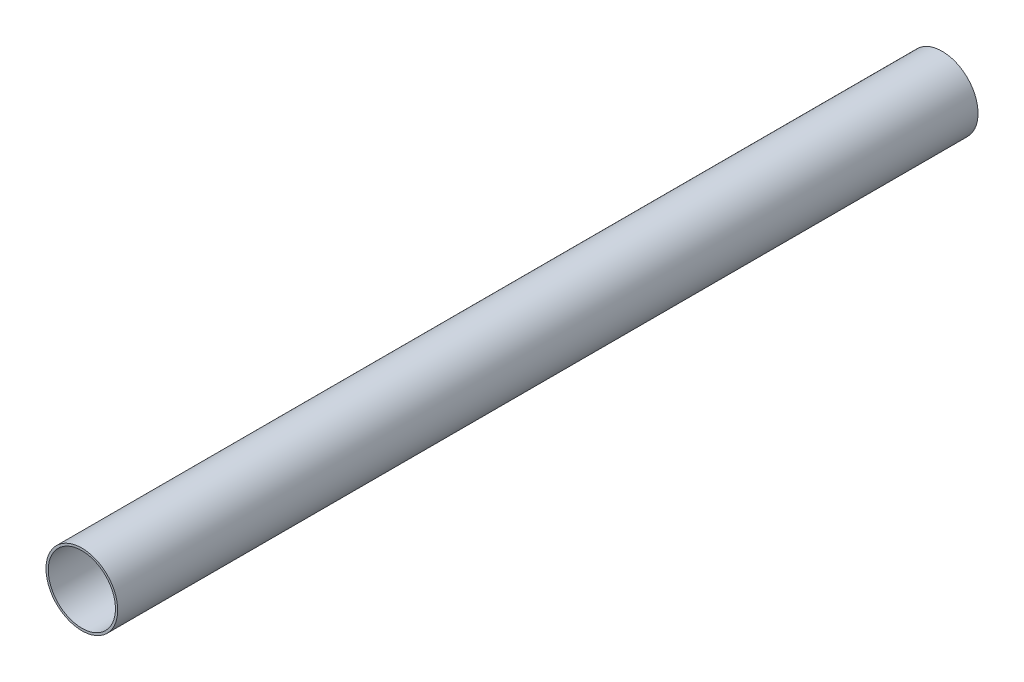
ISO-10303-21;
HEADER;
FILE_DESCRIPTION(('STEP AP214'),'2;1');
FILE_NAME('part.step','',(''),(''),'','','');
FILE_SCHEMA(('AUTOMOTIVE_DESIGN { 1 0 10303 214 1 1 1 1 }'));
ENDSEC;
DATA;
#1=APPLICATION_CONTEXT('core data for automotive mechanical design processes');
#2=APPLICATION_PROTOCOL_DEFINITION('international standard','automotive_design',2000,#1);
#3=PRODUCT_CONTEXT('',#1,'mechanical');
#4=PRODUCT('Part','Part','',(#3));
#5=PRODUCT_RELATED_PRODUCT_CATEGORY('part','',(#4));
#6=PRODUCT_DEFINITION_FORMATION('','',#4);
#7=PRODUCT_DEFINITION_CONTEXT('part definition',#1,'design');
#8=PRODUCT_DEFINITION('design','',#6,#7);
#9=PRODUCT_DEFINITION_SHAPE('','',#8);
#10=(LENGTH_UNIT() NAMED_UNIT(*) SI_UNIT(.MILLI.,.METRE.));
#11=(NAMED_UNIT(*) PLANE_ANGLE_UNIT() SI_UNIT($,.RADIAN.));
#12=(NAMED_UNIT(*) SI_UNIT($,.STERADIAN.) SOLID_ANGLE_UNIT());
#13=UNCERTAINTY_MEASURE_WITH_UNIT(LENGTH_MEASURE(1.E-05),#10,'distance_accuracy_value','');
#14=(GEOMETRIC_REPRESENTATION_CONTEXT(3) GLOBAL_UNCERTAINTY_ASSIGNED_CONTEXT((#13)) GLOBAL_UNIT_ASSIGNED_CONTEXT((#10,
#11,#12)) REPRESENTATION_CONTEXT('',''));
#15=CARTESIAN_POINT('',(0.,0.,0.));
#16=DIRECTION('',(0.,0.,1.));
#17=DIRECTION('',(1.,0.,0.));
#18=AXIS2_PLACEMENT_3D('',#15,#16,#17);
#19=CARTESIAN_POINT('',(0.,0.,1219.2));
#20=DIRECTION('',(0.,0.,1.));
#21=DIRECTION('',(1.,0.,0.));
#22=AXIS2_PLACEMENT_3D('',#19,#20,#21);
#23=PLANE('',#22);
#24=CARTESIAN_POINT('',(0.,0.,1219.2));
#25=DIRECTION('',(0.,0.,1.));
#26=DIRECTION('',(1.,0.,0.));
#27=AXIS2_PLACEMENT_3D('',#24,#25,#26);
#28=CIRCLE('',#27,50.8);
#29=CARTESIAN_POINT('',(-50.8,0.,1219.2));
#30=VERTEX_POINT('',#29);
#31=EDGE_CURVE('E10',#30,#30,#28,.T.);
#32=ORIENTED_EDGE('',*,*,#31,.T.);
#33=EDGE_LOOP('',(#32));
#34=FACE_BOUND('',#33,.T.);
#35=CARTESIAN_POINT('',(0.,0.,1219.2));
#36=DIRECTION('',(0.,0.,1.));
#37=DIRECTION('',(1.,0.,0.));
#38=AXIS2_PLACEMENT_3D('',#35,#36,#37);
#39=CIRCLE('',#38,47.625);
#40=CARTESIAN_POINT('',(-47.625,0.,1219.2));
#41=VERTEX_POINT('',#40);
#42=EDGE_CURVE('E50',#41,#41,#39,.T.);
#43=ORIENTED_EDGE('',*,*,#42,.F.);
#44=EDGE_LOOP('',(#43));
#45=FACE_BOUND('',#44,.T.);
#46=ADVANCED_FACE('F39',(#34,#45),#23,.T.);
#47=CARTESIAN_POINT('',(0.,0.,0.));
#48=DIRECTION('',(0.,0.,1.));
#49=DIRECTION('',(1.,0.,0.));
#50=AXIS2_PLACEMENT_3D('',#47,#48,#49);
#51=PLANE('',#50);
#52=CARTESIAN_POINT('',(0.,0.,0.));
#53=DIRECTION('',(0.,0.,1.));
#54=DIRECTION('',(1.,0.,0.));
#55=AXIS2_PLACEMENT_3D('',#52,#53,#54);
#56=CIRCLE('',#55,50.8);
#57=CARTESIAN_POINT('',(-50.8,0.,0.));
#58=VERTEX_POINT('',#57);
#59=EDGE_CURVE('E43',#58,#58,#56,.T.);
#60=ORIENTED_EDGE('',*,*,#59,.F.);
#61=EDGE_LOOP('',(#60));
#62=FACE_BOUND('',#61,.T.);
#63=CARTESIAN_POINT('',(0.,0.,0.));
#64=DIRECTION('',(0.,0.,1.));
#65=DIRECTION('',(1.,0.,0.));
#66=AXIS2_PLACEMENT_3D('',#63,#64,#65);
#67=CIRCLE('',#66,47.625);
#68=CARTESIAN_POINT('',(-47.625,0.,0.));
#69=VERTEX_POINT('',#68);
#70=EDGE_CURVE('E52',#69,#69,#67,.T.);
#71=ORIENTED_EDGE('',*,*,#70,.T.);
#72=EDGE_LOOP('',(#71));
#73=FACE_BOUND('',#72,.T.);
#74=ADVANCED_FACE('F62',(#62,#73),#51,.F.);
#75=CARTESIAN_POINT('',(0.,0.,1219.2));
#76=DIRECTION('',(0.,0.,-1.));
#77=DIRECTION('',(-1.,0.,0.));
#78=AXIS2_PLACEMENT_3D('',#75,#76,#77);
#79=CYLINDRICAL_SURFACE('',#78,50.8);
#80=CARTESIAN_POINT('',(-50.8,0.,1219.2));
#81=CARTESIAN_POINT('',(-50.8,0.,1206.5));
#82=CARTESIAN_POINT('',(-50.8,0.,1193.8));
#83=CARTESIAN_POINT('',(-50.8,0.,1168.4));
#84=CARTESIAN_POINT('',(-50.8,0.,1155.7));
#85=CARTESIAN_POINT('',(-50.8,0.,1130.3));
#86=CARTESIAN_POINT('',(-50.8,0.,1117.6));
#87=CARTESIAN_POINT('',(-50.8,0.,1092.2));
#88=CARTESIAN_POINT('',(-50.8,0.,1079.5));
#89=CARTESIAN_POINT('',(-50.8,0.,1054.1));
#90=CARTESIAN_POINT('',(-50.8,0.,1041.4));
#91=CARTESIAN_POINT('',(-50.8,0.,1016.));
#92=CARTESIAN_POINT('',(-50.8,0.,1003.3));
#93=CARTESIAN_POINT('',(-50.8,0.,977.9));
#94=CARTESIAN_POINT('',(-50.8,0.,965.2));
#95=CARTESIAN_POINT('',(-50.8,0.,939.8));
#96=CARTESIAN_POINT('',(-50.8,0.,927.1));
#97=CARTESIAN_POINT('',(-50.8,0.,901.7));
#98=CARTESIAN_POINT('',(-50.8,0.,889.));
#99=CARTESIAN_POINT('',(-50.8,0.,863.6));
#100=CARTESIAN_POINT('',(-50.8,0.,850.9));
#101=CARTESIAN_POINT('',(-50.8,0.,825.5));
#102=CARTESIAN_POINT('',(-50.8,0.,812.8));
#103=CARTESIAN_POINT('',(-50.8,0.,787.4));
#104=CARTESIAN_POINT('',(-50.8,0.,774.7));
#105=CARTESIAN_POINT('',(-50.8,0.,749.3));
#106=CARTESIAN_POINT('',(-50.8,0.,736.6));
#107=CARTESIAN_POINT('',(-50.8,0.,711.2));
#108=CARTESIAN_POINT('',(-50.8,0.,698.5));
#109=CARTESIAN_POINT('',(-50.8,0.,673.1));
#110=CARTESIAN_POINT('',(-50.8,0.,660.4));
#111=CARTESIAN_POINT('',(-50.8,0.,635.));
#112=CARTESIAN_POINT('',(-50.8,0.,622.3));
#113=CARTESIAN_POINT('',(-50.8,0.,596.9));
#114=CARTESIAN_POINT('',(-50.8,0.,584.2));
#115=CARTESIAN_POINT('',(-50.8,0.,558.8));
#116=CARTESIAN_POINT('',(-50.8,0.,546.1));
#117=CARTESIAN_POINT('',(-50.8,0.,520.7));
#118=CARTESIAN_POINT('',(-50.8,0.,508.));
#119=CARTESIAN_POINT('',(-50.8,0.,482.6));
#120=CARTESIAN_POINT('',(-50.8,0.,469.9));
#121=CARTESIAN_POINT('',(-50.8,0.,444.5));
#122=CARTESIAN_POINT('',(-50.8,0.,431.8));
#123=CARTESIAN_POINT('',(-50.8,0.,406.4));
#124=CARTESIAN_POINT('',(-50.8,0.,393.7));
#125=CARTESIAN_POINT('',(-50.8,0.,368.3));
#126=CARTESIAN_POINT('',(-50.8,0.,355.6));
#127=CARTESIAN_POINT('',(-50.8,0.,330.2));
#128=CARTESIAN_POINT('',(-50.8,0.,317.5));
#129=CARTESIAN_POINT('',(-50.8,0.,292.1));
#130=CARTESIAN_POINT('',(-50.8,0.,279.4));
#131=CARTESIAN_POINT('',(-50.8,0.,254.));
#132=CARTESIAN_POINT('',(-50.8,0.,241.3));
#133=CARTESIAN_POINT('',(-50.8,0.,215.9));
#134=CARTESIAN_POINT('',(-50.8,0.,203.2));
#135=CARTESIAN_POINT('',(-50.8,0.,177.8));
#136=CARTESIAN_POINT('',(-50.8,0.,165.1));
#137=CARTESIAN_POINT('',(-50.8,0.,139.7));
#138=CARTESIAN_POINT('',(-50.8,0.,127.));
#139=CARTESIAN_POINT('',(-50.8,0.,101.6));
#140=CARTESIAN_POINT('',(-50.8,0.,88.9));
#141=CARTESIAN_POINT('',(-50.8,0.,63.5));
#142=CARTESIAN_POINT('',(-50.8,0.,50.8));
#143=CARTESIAN_POINT('',(-50.8,0.,25.4));
#144=CARTESIAN_POINT('',(-50.8,0.,12.7));
#145=CARTESIAN_POINT('',(-50.8,0.,0.));
#146=B_SPLINE_CURVE_WITH_KNOTS('',3,(#80,#81,#82,#83,#84,#85,#86,#87,#88,#89,#90,#91,#92,#93,
#94,#95,#96,#97,#98,#99,#100,#101,#102,#103,#104,#105,#106,#107,#108,#109,#110,#111,#112,#113,
#114,#115,#116,#117,#118,#119,#120,#121,#122,#123,#124,#125,#126,#127,#128,#129,#130,#131,#132,
#133,#134,#135,#136,#137,#138,#139,#140,#141,#142,#143,#144,#145),.UNSPECIFIED.,.F.,.F.,(4,2,2,
2,2,2,2,2,2,2,2,2,2,2,2,2,2,2,2,2,2,2,2,2,2,2,2,2,2,2,2,2,4),(0.,38.1,76.2,114.3,152.4,190.5,
228.6,266.7,304.8,342.9,381.,419.1,457.2,495.3,533.4,571.5,609.6,647.7,685.8,723.9,762.,800.1,
838.2,876.3,914.4,952.5,990.6,1028.7,1066.8,1104.9,1143.,1181.1,1219.2),.UNSPECIFIED.);
#147=EDGE_CURVE('BSEAM41',#30,#58,#146,.T.);
#148=ORIENTED_EDGE('',*,*,#31,.F.);
#149=ORIENTED_EDGE('',*,*,#59,.T.);
#150=ORIENTED_EDGE('',*,*,#147,.T.);
#151=ORIENTED_EDGE('',*,*,#147,.F.);
#152=EDGE_LOOP('',(#148,#150,#149,#151));
#153=FACE_BOUND('',#152,.T.);
#154=ADVANCED_FACE('F41',(#153),#79,.T.);
#155=CARTESIAN_POINT('',(0.,0.,1219.2));
#156=DIRECTION('',(0.,0.,-1.));
#157=DIRECTION('',(-1.,0.,0.));
#158=AXIS2_PLACEMENT_3D('',#155,#156,#157);
#159=CYLINDRICAL_SURFACE('',#158,47.625);
#160=CARTESIAN_POINT('',(-47.625,0.,1219.2));
#161=CARTESIAN_POINT('',(-47.625,0.,1206.5));
#162=CARTESIAN_POINT('',(-47.625,0.,1193.8));
#163=CARTESIAN_POINT('',(-47.625,0.,1168.4));
#164=CARTESIAN_POINT('',(-47.625,0.,1155.7));
#165=CARTESIAN_POINT('',(-47.625,0.,1130.3));
#166=CARTESIAN_POINT('',(-47.625,0.,1117.6));
#167=CARTESIAN_POINT('',(-47.625,0.,1092.2));
#168=CARTESIAN_POINT('',(-47.625,0.,1079.5));
#169=CARTESIAN_POINT('',(-47.625,0.,1054.1));
#170=CARTESIAN_POINT('',(-47.625,0.,1041.4));
#171=CARTESIAN_POINT('',(-47.625,0.,1016.));
#172=CARTESIAN_POINT('',(-47.625,0.,1003.3));
#173=CARTESIAN_POINT('',(-47.625,0.,977.9));
#174=CARTESIAN_POINT('',(-47.625,0.,965.2));
#175=CARTESIAN_POINT('',(-47.625,0.,939.8));
#176=CARTESIAN_POINT('',(-47.625,0.,927.1));
#177=CARTESIAN_POINT('',(-47.625,0.,901.7));
#178=CARTESIAN_POINT('',(-47.625,0.,889.));
#179=CARTESIAN_POINT('',(-47.625,0.,863.6));
#180=CARTESIAN_POINT('',(-47.625,0.,850.9));
#181=CARTESIAN_POINT('',(-47.625,0.,825.5));
#182=CARTESIAN_POINT('',(-47.625,0.,812.8));
#183=CARTESIAN_POINT('',(-47.625,0.,787.4));
#184=CARTESIAN_POINT('',(-47.625,0.,774.7));
#185=CARTESIAN_POINT('',(-47.625,0.,749.3));
#186=CARTESIAN_POINT('',(-47.625,0.,736.6));
#187=CARTESIAN_POINT('',(-47.625,0.,711.2));
#188=CARTESIAN_POINT('',(-47.625,0.,698.5));
#189=CARTESIAN_POINT('',(-47.625,0.,673.1));
#190=CARTESIAN_POINT('',(-47.625,0.,660.4));
#191=CARTESIAN_POINT('',(-47.625,0.,635.));
#192=CARTESIAN_POINT('',(-47.625,0.,622.3));
#193=CARTESIAN_POINT('',(-47.625,0.,596.9));
#194=CARTESIAN_POINT('',(-47.625,0.,584.2));
#195=CARTESIAN_POINT('',(-47.625,0.,558.8));
#196=CARTESIAN_POINT('',(-47.625,0.,546.1));
#197=CARTESIAN_POINT('',(-47.625,0.,520.7));
#198=CARTESIAN_POINT('',(-47.625,0.,508.));
#199=CARTESIAN_POINT('',(-47.625,0.,482.6));
#200=CARTESIAN_POINT('',(-47.625,0.,469.9));
#201=CARTESIAN_POINT('',(-47.625,0.,444.5));
#202=CARTESIAN_POINT('',(-47.625,0.,431.8));
#203=CARTESIAN_POINT('',(-47.625,0.,406.4));
#204=CARTESIAN_POINT('',(-47.625,0.,393.7));
#205=CARTESIAN_POINT('',(-47.625,0.,368.3));
#206=CARTESIAN_POINT('',(-47.625,0.,355.6));
#207=CARTESIAN_POINT('',(-47.625,0.,330.2));
#208=CARTESIAN_POINT('',(-47.625,0.,317.5));
#209=CARTESIAN_POINT('',(-47.625,0.,292.1));
#210=CARTESIAN_POINT('',(-47.625,0.,279.4));
#211=CARTESIAN_POINT('',(-47.625,0.,254.));
#212=CARTESIAN_POINT('',(-47.625,0.,241.3));
#213=CARTESIAN_POINT('',(-47.625,0.,215.9));
#214=CARTESIAN_POINT('',(-47.625,0.,203.2));
#215=CARTESIAN_POINT('',(-47.625,0.,177.8));
#216=CARTESIAN_POINT('',(-47.625,0.,165.1));
#217=CARTESIAN_POINT('',(-47.625,0.,139.7));
#218=CARTESIAN_POINT('',(-47.625,0.,127.));
#219=CARTESIAN_POINT('',(-47.625,0.,101.6));
#220=CARTESIAN_POINT('',(-47.625,0.,88.9));
#221=CARTESIAN_POINT('',(-47.625,0.,63.5));
#222=CARTESIAN_POINT('',(-47.625,0.,50.8));
#223=CARTESIAN_POINT('',(-47.625,0.,25.4));
#224=CARTESIAN_POINT('',(-47.625,0.,12.7));
#225=CARTESIAN_POINT('',(-47.625,0.,0.));
#226=B_SPLINE_CURVE_WITH_KNOTS('',3,(#160,#161,#162,#163,#164,#165,#166,#167,#168,#169,#170,
#171,#172,#173,#174,#175,#176,#177,#178,#179,#180,#181,#182,#183,#184,#185,#186,#187,#188,#189,
#190,#191,#192,#193,#194,#195,#196,#197,#198,#199,#200,#201,#202,#203,#204,#205,#206,#207,#208,
#209,#210,#211,#212,#213,#214,#215,#216,#217,#218,#219,#220,#221,#222,#223,#224,#225),
.UNSPECIFIED.,.F.,.F.,(4,2,2,2,2,2,2,2,2,2,2,2,2,2,2,2,2,2,2,2,2,2,2,2,2,2,2,2,2,2,2,2,4),(0.,
38.0999999999998,76.1999999999998,114.3,152.4,190.5,228.6,266.7,304.8,342.9,381.,419.1,457.2,
495.3,533.4,571.5,609.6,647.7,685.8,723.9,762.,800.1,838.2,876.3,914.4,952.5,990.6,1028.7,
1066.8,1104.9,1143.,1181.1,1219.2),.UNSPECIFIED.);
#227=EDGE_CURVE('BSEAM58',#41,#69,#226,.T.);
#228=ORIENTED_EDGE('',*,*,#42,.T.);
#229=ORIENTED_EDGE('',*,*,#70,.F.);
#230=ORIENTED_EDGE('',*,*,#227,.T.);
#231=ORIENTED_EDGE('',*,*,#227,.F.);
#232=EDGE_LOOP('',(#228,#230,#229,#231));
#233=FACE_BOUND('',#232,.T.);
#234=ADVANCED_FACE('F58',(#233),#159,.F.);
#235=CLOSED_SHELL('',(#46,#74,#154,#234));
#236=MANIFOLD_SOLID_BREP('B2',#235);
#237=ADVANCED_BREP_SHAPE_REPRESENTATION('',(#18,#236),#14);
#238=SHAPE_DEFINITION_REPRESENTATION(#9,#237);
ENDSEC;
END-ISO-10303-21;
